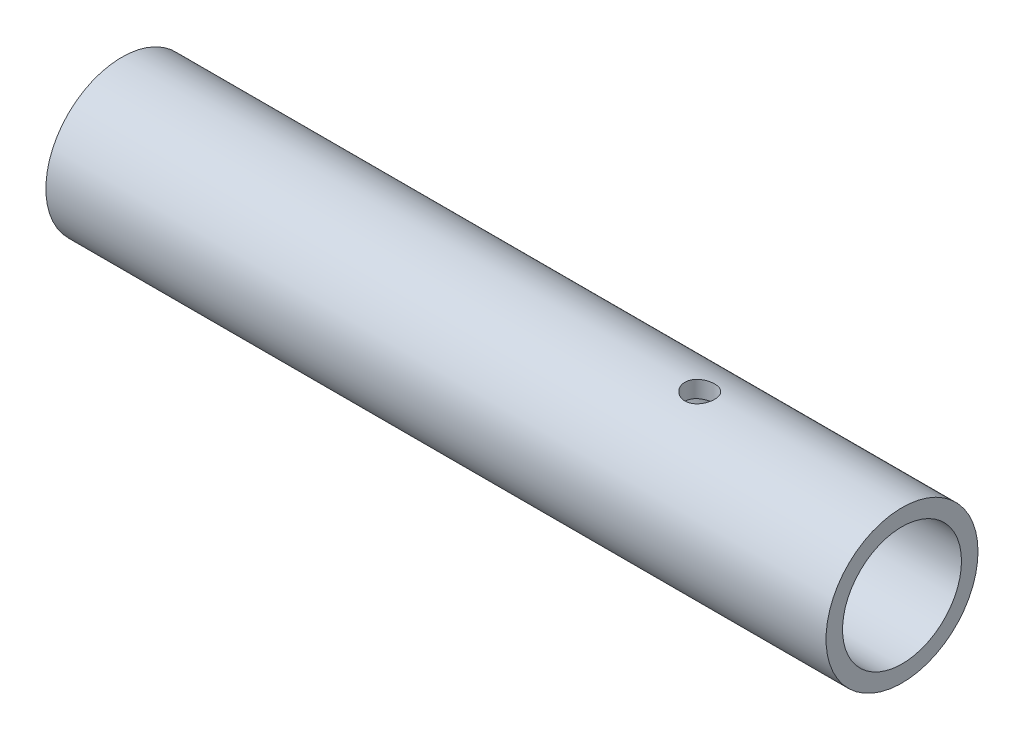
ISO-10303-21;
HEADER;
FILE_DESCRIPTION(('STEP AP214'),'2;1');
FILE_NAME('part.step','',(''),(''),'','','');
FILE_SCHEMA(('AUTOMOTIVE_DESIGN { 1 0 10303 214 1 1 1 1 }'));
ENDSEC;
DATA;
#1=APPLICATION_CONTEXT('core data for automotive mechanical design processes');
#2=APPLICATION_PROTOCOL_DEFINITION('international standard','automotive_design',2000,#1);
#3=PRODUCT_CONTEXT('',#1,'mechanical');
#4=PRODUCT('Part','Part','',(#3));
#5=PRODUCT_RELATED_PRODUCT_CATEGORY('part','',(#4));
#6=PRODUCT_DEFINITION_FORMATION('','',#4);
#7=PRODUCT_DEFINITION_CONTEXT('part definition',#1,'design');
#8=PRODUCT_DEFINITION('design','',#6,#7);
#9=PRODUCT_DEFINITION_SHAPE('','',#8);
#10=(LENGTH_UNIT() NAMED_UNIT(*) SI_UNIT(.MILLI.,.METRE.));
#11=(NAMED_UNIT(*) PLANE_ANGLE_UNIT() SI_UNIT($,.RADIAN.));
#12=(NAMED_UNIT(*) SI_UNIT($,.STERADIAN.) SOLID_ANGLE_UNIT());
#13=UNCERTAINTY_MEASURE_WITH_UNIT(LENGTH_MEASURE(1.E-05),#10,'distance_accuracy_value','');
#14=(GEOMETRIC_REPRESENTATION_CONTEXT(3) GLOBAL_UNCERTAINTY_ASSIGNED_CONTEXT((#13)) GLOBAL_UNIT_ASSIGNED_CONTEXT((#10,
#11,#12)) REPRESENTATION_CONTEXT('',''));
#15=CARTESIAN_POINT('',(0.,0.,0.));
#16=DIRECTION('',(0.,0.,1.));
#17=DIRECTION('',(1.,0.,0.));
#18=AXIS2_PLACEMENT_3D('',#15,#16,#17);
#19=CARTESIAN_POINT('',(254.,0.,0.));
#20=DIRECTION('',(-1.,0.,0.));
#21=DIRECTION('',(0.,0.,1.));
#22=AXIS2_PLACEMENT_3D('',#19,#20,#21);
#23=CYLINDRICAL_SURFACE('',#22,16.7005);
#24=CARTESIAN_POINT('',(0.,0.,0.));
#25=DIRECTION('',(1.,0.,0.));
#26=DIRECTION('',(0.,0.,-1.));
#27=AXIS2_PLACEMENT_3D('',#24,#25,#26);
#28=CIRCLE('',#27,16.7005);
#29=CARTESIAN_POINT('',(0.,0.,-16.7005));
#30=VERTEX_POINT('',#29);
#31=EDGE_CURVE('E10',#30,#30,#28,.T.);
#32=ORIENTED_EDGE('',*,*,#31,.T.);
#33=EDGE_LOOP('',(#32));
#34=FACE_BOUND('',#33,.T.);
#35=CARTESIAN_POINT('',(127.,16.3784509963549,3.26389999999997));
#36=CARTESIAN_POINT('',(126.818553713714,16.3784545734147,3.26389319517557));
#37=CARTESIAN_POINT('',(126.637020772944,16.3814989535375,3.24871822583977));
#38=CARTESIAN_POINT('',(126.279084138745,16.393330666063,3.18846627888111));
#39=CARTESIAN_POINT('',(126.102684764659,16.4021226964371,3.1433648397313));
#40=CARTESIAN_POINT('',(125.760245700198,16.4244167855804,3.02470671339751));
#41=CARTESIAN_POINT('',(125.594196130777,16.4379142691773,2.95117765920535));
#42=CARTESIAN_POINT('',(125.27679656067,16.4680930077172,2.77782627707842));
#43=CARTESIAN_POINT('',(125.125445619345,16.4847740587251,2.6780056331935));
#44=CARTESIAN_POINT('',(124.839685782665,16.5196921397592,2.45346715399136));
#45=CARTESIAN_POINT('',(124.705504337154,16.5379455711721,2.32846235907666));
#46=CARTESIAN_POINT('',(124.459876610062,16.5738071694482,2.05772407732135));
#47=CARTESIAN_POINT('',(124.348431883978,16.591415292096,1.91198917342002));
#48=CARTESIAN_POINT('',(124.150562586048,16.6241787687936,1.60242588580065));
#49=CARTESIAN_POINT('',(124.064353531285,16.6393125342302,1.43845726533343));
#50=CARTESIAN_POINT('',(123.920792617122,16.6652381312399,1.09801784501548));
#51=CARTESIAN_POINT('',(123.86343817922,16.6760303507642,0.921548163890675));
#52=CARTESIAN_POINT('',(123.779920880201,16.6919410030019,0.563475145343534));
#53=CARTESIAN_POINT('',(123.753374176773,16.6971292000769,0.381964487071239));
#54=CARTESIAN_POINT('',(123.731028925503,16.7014880032639,0.0169965480074079));
#55=CARTESIAN_POINT('',(123.735227542913,16.7006591641522,-0.166460551763006));
#56=CARTESIAN_POINT('',(123.773961410014,16.6931315126249,-0.527478063177689));
#57=CARTESIAN_POINT('',(123.808083259146,16.6865126940083,-0.705084738918122));
#58=CARTESIAN_POINT('',(123.905039985385,16.6682388041442,-1.05200191286461));
#59=CARTESIAN_POINT('',(123.967875974111,16.6565835379202,-1.22131208960472));
#60=CARTESIAN_POINT('',(124.120864327927,16.6294138104733,-1.54801686284208));
#61=CARTESIAN_POINT('',(124.211179877845,16.6138763968313,-1.7053330568331));
#62=CARTESIAN_POINT('',(124.416443068428,16.5806572402267,-2.00273080915886));
#63=CARTESIAN_POINT('',(124.531393421363,16.5629752612425,-2.14281046709115));
#64=CARTESIAN_POINT('',(124.784934887528,16.5270746871382,-2.40421067249115));
#65=CARTESIAN_POINT('',(124.923887754359,16.5088520592065,-2.52518004544845));
#66=CARTESIAN_POINT('',(125.220290366222,16.4742040536849,-2.74215423995587));
#67=CARTESIAN_POINT('',(125.377740430266,16.4577787071014,-2.83815863085572));
#68=CARTESIAN_POINT('',(125.70715791349,16.4285778238497,-3.00259091721656));
#69=CARTESIAN_POINT('',(125.87915331242,16.4158095388093,-3.07096413127713));
#70=CARTESIAN_POINT('',(126.232497463898,16.3954764923766,-3.17774053863906));
#71=CARTESIAN_POINT('',(126.413845054132,16.3879110860246,-3.21614744670498));
#72=CARTESIAN_POINT('',(126.777568960479,16.3789689965078,-3.26138067693054));
#73=CARTESIAN_POINT('',(126.959879959505,16.377493133792,-3.26871315798878));
#74=CARTESIAN_POINT('',(127.323120534865,16.3806313171536,-3.25294947975415));
#75=CARTESIAN_POINT('',(127.504050185252,16.3852450344327,-3.22985496332418));
#76=CARTESIAN_POINT('',(127.857704709797,16.3999498332161,-3.15432854360267));
#77=CARTESIAN_POINT('',(128.03048920925,16.409990751327,-3.10216518758293));
#78=CARTESIAN_POINT('',(128.364865954816,16.4343748926875,-2.97026813679652));
#79=CARTESIAN_POINT('',(128.526457313451,16.4487184566051,-2.89053225886072));
#80=CARTESIAN_POINT('',(128.836081213854,16.4803156776608,-2.70460067314256));
#81=CARTESIAN_POINT('',(128.983919341983,16.4976034233431,-2.59808712150518));
#82=CARTESIAN_POINT('',(129.259807826755,16.5330467132823,-2.36204922324446));
#83=CARTESIAN_POINT('',(129.387856240651,16.5512023425103,-2.23252262011955));
#84=CARTESIAN_POINT('',(129.622439097894,16.5866564256626,-1.95186745841594));
#85=CARTESIAN_POINT('',(129.728631982575,16.6039384859889,-1.80045100835698));
#86=CARTESIAN_POINT('',(129.914071192321,16.6354166114285,-1.48163273835385));
#87=CARTESIAN_POINT('',(129.993318615317,16.6496128022712,-1.31423157008527));
#88=CARTESIAN_POINT('',(130.122114494975,16.6732494760108,-0.969110676321435));
#89=CARTESIAN_POINT('',(130.171826225197,16.6827160570596,-0.791453749445667));
#90=CARTESIAN_POINT('',(130.240658350753,16.6959385983282,-0.430108531071001));
#91=CARTESIAN_POINT('',(130.25978225666,16.6996952138801,-0.246420934183898));
#92=CARTESIAN_POINT('',(130.266765017419,16.701059976732,0.118504114218192));
#93=CARTESIAN_POINT('',(130.255138258006,16.6987692823771,0.299731543011307));
#94=CARTESIAN_POINT('',(130.202082074801,16.6885085729308,0.657597247741723));
#95=CARTESIAN_POINT('',(130.160652991613,16.6805386227465,0.834235576103096));
#96=CARTESIAN_POINT('',(130.04939244875,16.6598166907006,1.17760651202132));
#97=CARTESIAN_POINT('',(129.979620182091,16.6470746793019,1.34435893899573));
#98=CARTESIAN_POINT('',(129.81371758837,16.6181833340721,1.66386484230208));
#99=CARTESIAN_POINT('',(129.717585294415,16.6020337460002,1.81661727286795));
#100=CARTESIAN_POINT('',(129.499943134021,16.567790330572,2.10633794767418));
#101=CARTESIAN_POINT('',(129.378063903588,16.5496703049923,2.2430256556268));
#102=CARTESIAN_POINT('',(129.113149352625,16.5136874296903,2.49418621724253));
#103=CARTESIAN_POINT('',(128.97010904311,16.4958246417077,2.60865381748637));
#104=CARTESIAN_POINT('',(128.665184399487,16.4621787073227,2.81322943497199));
#105=CARTESIAN_POINT('',(128.503122773793,16.4464186262533,2.90307713484601));
#106=CARTESIAN_POINT('',(128.165943578095,16.4190426235692,3.05412503906776));
#107=CARTESIAN_POINT('',(127.990838204351,16.4074228879929,3.11535162462943));
#108=CARTESIAN_POINT('',(127.679408964778,16.3920013024287,3.19533359258452));
#109=CARTESIAN_POINT('',(127.544879355037,16.3869509369549,3.22100071612694));
#110=CARTESIAN_POINT('',(127.2735828724,16.3801744879065,3.25528621562195));
#111=CARTESIAN_POINT('',(127.136816070436,16.3784482991421,3.26390513104648));
#112=CARTESIAN_POINT('',(127.,16.3784509963549,3.26389999999997));
#113=B_SPLINE_CURVE_WITH_KNOTS('',3,(#35,#36,#37,#38,#39,#40,#41,#42,#43,#44,#45,#46,#47,#48,
#49,#50,#51,#52,#53,#54,#55,#56,#57,#58,#59,#60,#61,#62,#63,#64,#65,#66,#67,#68,#69,#70,#71,#72,
#73,#74,#75,#76,#77,#78,#79,#80,#81,#82,#83,#84,#85,#86,#87,#88,#89,#90,#91,#92,#93,#94,#95,#96,
#97,#98,#99,#100,#101,#102,#103,#104,#105,#106,#107,#108,#109,#110,#111,#112),.UNSPECIFIED.,.T.,
.F.,(4,2,2,2,2,2,2,2,2,2,2,2,2,2,2,2,2,2,2,2,2,2,2,2,2,2,2,2,2,2,2,2,2,2,2,2,2,2,4),(0.,
0.543838011851132,1.08812109867869,1.63187644133418,2.17559696340594,2.72590420295353,
3.2762490782831,3.831165346531,4.38603201763736,4.93390859919531,5.48173466666149,
6.02210947590471,6.56250520661795,7.10617482279139,7.64990432727748,8.20268697648642,
8.7554791606594,9.30936001165929,9.86317219006378,10.4079280171506,10.9526544321187,
11.4924299764933,12.032248269632,12.5788044673675,13.125414286251,13.6800080693687,
14.2345792520847,14.7860555271326,15.3374685045301,15.8797162227245,16.4219577437688,
16.9630726011032,17.504227845529,18.0537494335348,18.6034007851143,19.1586573535361,
19.713401105892,20.1234846400338,20.5335551973219),.UNSPECIFIED.);
#114=CARTESIAN_POINT('',(127.,16.3784509963549,3.26389999999997));
#115=VERTEX_POINT('',#114);
#116=EDGE_CURVE('E79',#115,#115,#113,.T.);
#117=ORIENTED_EDGE('',*,*,#116,.T.);
#118=EDGE_LOOP('',(#117));
#119=FACE_BOUND('',#118,.T.);
#120=CARTESIAN_POINT('',(123.7361,-16.7005,0.));
#121=CARTESIAN_POINT('',(123.736106775756,-16.7004966719391,0.181483597947742));
#122=CARTESIAN_POINT('',(123.751287775446,-16.6975113087399,0.363053771332893));
#123=CARTESIAN_POINT('',(123.811565845321,-16.6858899817864,0.721067717038991));
#124=CARTESIAN_POINT('',(123.856687233667,-16.677249424853,0.897507200417728));
#125=CARTESIAN_POINT('',(123.975403683828,-16.6552831908012,1.24003120402988));
#126=CARTESIAN_POINT('',(124.048972050381,-16.6419619072453,1.40612526346626));
#127=CARTESIAN_POINT('',(124.222416098506,-16.6120847923371,1.72359982001725));
#128=CARTESIAN_POINT('',(124.322290005034,-16.5955291792501,1.8749813089626));
#129=CARTESIAN_POINT('',(124.54688305753,-16.5607675429942,2.1607084870949));
#130=CARTESIAN_POINT('',(124.671877204119,-16.5425445895903,2.29483597685554));
#131=CARTESIAN_POINT('',(124.942571297181,-16.5066262038143,2.54035904431321));
#132=CARTESIAN_POINT('',(125.088272810045,-16.4889308114717,2.65175290078985));
#133=CARTESIAN_POINT('',(125.397805025885,-16.4559060542504,2.84956751041692));
#134=CARTESIAN_POINT('',(125.56178170667,-16.440598490149,2.93576380448387));
#135=CARTESIAN_POINT('',(125.902238566393,-16.4143223190422,3.07929892720361));
#136=CARTESIAN_POINT('',(126.078717567108,-16.4033533038102,3.13664047102126));
#137=CARTESIAN_POINT('',(126.43682660245,-16.3871671511717,3.22013301241122));
#138=CARTESIAN_POINT('',(126.61836433271,-16.3818796336776,3.24666599436722));
#139=CARTESIAN_POINT('',(126.983385832867,-16.3774431798516,3.26897441242651));
#140=CARTESIAN_POINT('',(127.166869411181,-16.3782936446905,3.26475284898047));
#141=CARTESIAN_POINT('',(127.527789679386,-16.3859730690505,3.22598118443871));
#142=CARTESIAN_POINT('',(127.705275371228,-16.3927159656055,3.19186765635166));
#143=CARTESIAN_POINT('',(128.051954938799,-16.4112851101643,3.09496894705632));
#144=CARTESIAN_POINT('',(128.221148434318,-16.4231115910164,3.03218245250376));
#145=CARTESIAN_POINT('',(128.547706130163,-16.4506040829533,2.87929947973738));
#146=CARTESIAN_POINT('',(128.704986618325,-16.4662944654566,2.78902875651037));
#147=CARTESIAN_POINT('',(129.002331662869,-16.4997310306065,2.58386283029639));
#148=CARTESIAN_POINT('',(129.142394323867,-16.5174774391689,2.46896492009798));
#149=CARTESIAN_POINT('',(129.40384820398,-16.5534001313523,2.21546259747301));
#150=CARTESIAN_POINT('',(129.52487784656,-16.5715785664494,2.07648527306975));
#151=CARTESIAN_POINT('',(129.741962257696,-16.6060378767627,1.78001160313921));
#152=CARTESIAN_POINT('',(129.838016733025,-16.6223187296989,1.6225150402147));
#153=CARTESIAN_POINT('',(130.002485980909,-16.6511857448123,1.29308111551052));
#154=CARTESIAN_POINT('',(130.070860808202,-16.6637665602585,1.12112331316856));
#155=CARTESIAN_POINT('',(130.177651774277,-16.6837751432131,0.767861427035756));
#156=CARTESIAN_POINT('',(130.216071375564,-16.691203506279,0.586558426034048));
#157=CARTESIAN_POINT('',(130.261352603597,-16.6999876907162,0.222861171440751));
#158=CARTESIAN_POINT('',(130.2687092719,-16.7014387613551,0.0405307799548781));
#159=CARTESIAN_POINT('',(130.252987038392,-16.6983688866494,-0.322754231602682));
#160=CARTESIAN_POINT('',(130.229909766959,-16.6938482612146,-0.503708924849627));
#161=CARTESIAN_POINT('',(130.154386130064,-16.679402432097,-0.857518845901425));
#162=CARTESIAN_POINT('',(130.102192463689,-16.6695237507744,-1.0304300801412));
#163=CARTESIAN_POINT('',(129.970192763857,-16.6454652259661,-1.36504700995945));
#164=CARTESIAN_POINT('',(129.890384732214,-16.6312850712336,-1.52675189362589));
#165=CARTESIAN_POINT('',(129.704341624287,-16.5999591227001,-1.83646298433188));
#166=CARTESIAN_POINT('',(129.597806850211,-16.5827804191035,-1.98428576503835));
#167=CARTESIAN_POINT('',(129.361737252328,-16.5474430314081,-2.26013352813523));
#168=CARTESIAN_POINT('',(129.232200081546,-16.5292842474417,-2.38815648781824));
#169=CARTESIAN_POINT('',(128.951553730027,-16.4937141213386,-2.62267015659225));
#170=CARTESIAN_POINT('',(128.800159005092,-16.4763174339377,-2.72882175212988));
#171=CARTESIAN_POINT('',(128.481396569498,-16.4445457864632,-2.91418860150566));
#172=CARTESIAN_POINT('',(128.314029482456,-16.4301707084856,-2.99340490644003));
#173=CARTESIAN_POINT('',(127.968898428124,-16.406186989638,-3.12218287646266));
#174=CARTESIAN_POINT('',(127.791192165306,-16.3965542890212,-3.17189449915426));
#175=CARTESIAN_POINT('',(127.429741750409,-16.3830934803205,-3.24070974683919));
#176=CARTESIAN_POINT('',(127.245998348699,-16.3792646536275,-3.25981716112136));
#177=CARTESIAN_POINT('',(126.881091191514,-16.3778837287058,-3.26674633387894));
#178=CARTESIAN_POINT('',(126.69993779729,-16.3802241945844,-3.25510358772846));
#179=CARTESIAN_POINT('',(126.342224427647,-16.3906787750187,-3.20204126403765));
#180=CARTESIAN_POINT('',(126.165664418971,-16.3987928477609,-3.16062190214508));
#181=CARTESIAN_POINT('',(125.822470853863,-16.419833385607,-3.04941620512077));
#182=CARTESIAN_POINT('',(125.655816247381,-16.4327491889843,-2.97969268503245));
#183=CARTESIAN_POINT('',(125.336486037849,-16.4619445128348,-2.81391821816692));
#184=CARTESIAN_POINT('',(125.183811540286,-16.4782242989868,-2.71786519175718));
#185=CARTESIAN_POINT('',(124.894102989115,-16.5126437731481,-2.50031714525346));
#186=CARTESIAN_POINT('',(124.757363204566,-16.5308093725168,-2.37843427754532));
#187=CARTESIAN_POINT('',(124.506099262145,-16.5667647976037,-2.11349014710452));
#188=CARTESIAN_POINT('',(124.391580214566,-16.5845545360457,-1.97042402598339));
#189=CARTESIAN_POINT('',(124.186940635134,-16.6179613743855,-1.66547201824119));
#190=CARTESIAN_POINT('',(124.09707321668,-16.6335551890088,-1.50341363159979));
#191=CARTESIAN_POINT('',(123.945987585852,-16.6605847291089,-1.16623959090203));
#192=CARTESIAN_POINT('',(123.884743144469,-16.6720242592617,-0.991136062224215));
#193=CARTESIAN_POINT('',(123.804717605944,-16.6871929046613,-0.679660912139079));
#194=CARTESIAN_POINT('',(123.779031167417,-16.6921542444122,-0.545080722884243));
#195=CARTESIAN_POINT('',(123.744720059972,-16.6988089990342,-0.27368339169512));
#196=CARTESIAN_POINT('',(123.736094890047,-16.7005025098655,-0.136866315566457));
#197=CARTESIAN_POINT('',(123.7361,-16.7005,0.));
#198=B_SPLINE_CURVE_WITH_KNOTS('',3,(#120,#121,#122,#123,#124,#125,#126,#127,#128,#129,#130,
#131,#132,#133,#134,#135,#136,#137,#138,#139,#140,#141,#142,#143,#144,#145,#146,#147,#148,#149,
#150,#151,#152,#153,#154,#155,#156,#157,#158,#159,#160,#161,#162,#163,#164,#165,#166,#167,#168,
#169,#170,#171,#172,#173,#174,#175,#176,#177,#178,#179,#180,#181,#182,#183,#184,#185,#186,#187,
#188,#189,#190,#191,#192,#193,#194,#195,#196,#197),.UNSPECIFIED.,.T.,.F.,(4,2,2,2,2,2,2,2,2,2,2,
2,2,2,2,2,2,2,2,2,2,2,2,2,2,2,2,2,2,2,2,2,2,2,2,2,2,2,4),(0.,0.543950159324411,1.08834266710056,
1.63222554010916,2.17607172242006,2.72623219078756,3.27643429774323,3.83139784085203,
4.38630915341318,4.93426426573039,5.48216591959973,6.02219638264132,6.5622515838647,
7.10580456443049,7.64941732722914,8.20235688641288,8.75530293719887,9.30904413910584,
9.86272132492762,10.4075405998757,10.9523306894876,11.4924645384159,12.0326374797938,
12.5791618209733,13.1257419570842,13.6802470524964,14.2347305069643,14.7863711140939,
15.3379434140415,15.8799740141397,16.4220006887916,16.9628309703467,17.5037039816243,
18.0533608295184,18.6031439372836,19.1583769915035,19.7131002487933,20.1233336874724,
20.53355507938),.UNSPECIFIED.);
#199=CARTESIAN_POINT('',(123.7361,-16.7005,0.));
#200=VERTEX_POINT('',#199);
#201=EDGE_CURVE('E51',#200,#200,#198,.T.);
#202=ORIENTED_EDGE('',*,*,#201,.T.);
#203=EDGE_LOOP('',(#202));
#204=FACE_BOUND('',#203,.T.);
#205=CARTESIAN_POINT('',(171.45,0.,0.));
#206=DIRECTION('',(1.,0.,0.));
#207=DIRECTION('',(0.,0.,-1.));
#208=AXIS2_PLACEMENT_3D('',#205,#206,#207);
#209=CIRCLE('',#208,16.7005);
#210=CARTESIAN_POINT('',(171.45,0.,-16.7005));
#211=VERTEX_POINT('',#210);
#212=EDGE_CURVE('E85',#211,#211,#209,.T.);
#213=ORIENTED_EDGE('',*,*,#212,.F.);
#214=EDGE_LOOP('',(#213));
#215=FACE_BOUND('',#214,.T.);
#216=ADVANCED_FACE('F38',(#34,#119,#204,#215),#23,.T.);
#217=CARTESIAN_POINT('',(254.,0.,0.));
#218=DIRECTION('',(-1.,0.,0.));
#219=DIRECTION('',(0.,0.,1.));
#220=AXIS2_PLACEMENT_3D('',#217,#218,#219);
#221=CYLINDRICAL_SURFACE('',#220,13.0683);
#222=CARTESIAN_POINT('',(0.,0.,0.));
#223=DIRECTION('',(1.,0.,0.));
#224=DIRECTION('',(0.,0.,-1.));
#225=AXIS2_PLACEMENT_3D('',#222,#223,#224);
#226=CIRCLE('',#225,13.0683);
#227=CARTESIAN_POINT('',(0.,0.,-13.0683));
#228=VERTEX_POINT('',#227);
#229=EDGE_CURVE('E46',#228,#228,#226,.T.);
#230=ORIENTED_EDGE('',*,*,#229,.F.);
#231=EDGE_LOOP('',(#230));
#232=FACE_BOUND('',#231,.T.);
#233=CARTESIAN_POINT('',(127.,12.6541464224182,3.26389999999997));
#234=CARTESIAN_POINT('',(126.8197603801,12.6541498665457,3.26389487005727));
#235=CARTESIAN_POINT('',(126.639463951856,12.658039343354,3.24891931447462));
#236=CARTESIAN_POINT('',(126.284048208243,12.6731373508395,3.18950804081929));
#237=CARTESIAN_POINT('',(126.108931974098,12.6843501494954,3.14505514333585));
#238=CARTESIAN_POINT('',(125.769068951021,12.7127474566362,3.02821731292329));
#239=CARTESIAN_POINT('',(125.60430910977,12.7299242628337,2.95586839338792));
#240=CARTESIAN_POINT('',(125.289247792188,12.7683046059048,2.78540185976016));
#241=CARTESIAN_POINT('',(125.138946922729,12.7895083116843,2.68728316470388));
#242=CARTESIAN_POINT('',(124.853768877992,12.8340746644002,2.46576046210242));
#243=CARTESIAN_POINT('',(124.71925608506,12.8574717499442,2.34189420249946));
#244=CARTESIAN_POINT('',(124.472682494661,12.9034898264856,2.07338814629195));
#245=CARTESIAN_POINT('',(124.360623793113,12.9261107448704,1.92874641261629));
#246=CARTESIAN_POINT('',(124.160648913987,12.9684086913342,1.62029941508486));
#247=CARTESIAN_POINT('',(124.073090635481,12.9880403413031,1.4562553539038));
#248=CARTESIAN_POINT('',(123.926929063669,13.021754935617,1.11520517144153));
#249=CARTESIAN_POINT('',(123.868321506807,13.0358386969344,0.938200963205097));
#250=CARTESIAN_POINT('',(123.78289198644,13.0566271990577,0.580053588307859));
#251=CARTESIAN_POINT('',(123.755451261866,13.063475389697,0.399066486178454));
#252=CARTESIAN_POINT('',(123.731192153959,13.0695210078802,0.0349367976721225));
#253=CARTESIAN_POINT('',(123.734369251653,13.0687195644559,-0.148205466633079));
#254=CARTESIAN_POINT('',(123.770810448584,13.059663021681,-0.507155486008183));
#255=CARTESIAN_POINT('',(123.803406660556,13.0515733895928,-0.683035849279494));
#256=CARTESIAN_POINT('',(123.896687326312,13.0290420651723,-1.02674690486388));
#257=CARTESIAN_POINT('',(123.957373273676,13.0146000350744,-1.19457716861578));
#258=CARTESIAN_POINT('',(124.105651562321,12.980733407514,-1.51918431677917));
#259=CARTESIAN_POINT('',(124.193481718752,12.9612650318926,-1.67584781392577));
#260=CARTESIAN_POINT('',(124.393374865019,12.9194576855627,-1.97244647237706));
#261=CARTESIAN_POINT('',(124.505442063498,12.8971182165768,-2.11237872182197));
#262=CARTESIAN_POINT('',(124.754208884998,12.8512911900573,-2.37552576964437));
#263=CARTESIAN_POINT('',(124.891492131556,12.8277889203778,-2.49818686603543));
#264=CARTESIAN_POINT('',(125.184925871298,12.7828374370845,-2.71886950242736));
#265=CARTESIAN_POINT('',(125.341077242306,12.7613883190751,-2.81688989538567));
#266=CARTESIAN_POINT('',(125.668899277047,12.7229191456513,-2.98586230738371));
#267=CARTESIAN_POINT('',(125.840641276096,12.7059209896026,-3.0566812595333));
#268=CARTESIAN_POINT('',(126.194120414262,12.6785594740963,-3.16826944176));
#269=CARTESIAN_POINT('',(126.375855410288,12.6681946980278,-3.20904508810496));
#270=CARTESIAN_POINT('',(126.7390274426,12.6555707305042,-3.25847099196052));
#271=CARTESIAN_POINT('',(126.920346028074,12.6531050561873,-3.26793982748043));
#272=CARTESIAN_POINT('',(127.281972860564,12.6559964618753,-3.25672414151975));
#273=CARTESIAN_POINT('',(127.462281198856,12.6613528233241,-3.23604238976434));
#274=CARTESIAN_POINT('',(127.813731132622,12.6790869347488,-3.16583028143518));
#275=CARTESIAN_POINT('',(127.984974313241,12.6913486522407,-3.11677631143261));
#276=CARTESIAN_POINT('',(128.316807037039,12.7214017722217,-2.99174032174483));
#277=CARTESIAN_POINT('',(128.477395317418,12.7391938287409,-2.91575511696363));
#278=CARTESIAN_POINT('',(128.78682868142,12.7787378056656,-2.73729950737114));
#279=CARTESIAN_POINT('',(128.935382208881,12.800560449758,-2.63433957686156));
#280=CARTESIAN_POINT('',(129.213404181874,12.8455331169144,-2.40547632524734));
#281=CARTESIAN_POINT('',(129.34286949108,12.8686833572457,-2.27956924135));
#282=CARTESIAN_POINT('',(129.582354798878,12.9144023998633,-2.00462943791343));
#283=CARTESIAN_POINT('',(129.691808598572,12.9369422542905,-1.85509782138161));
#284=CARTESIAN_POINT('',(129.884052208416,12.978302496039,-1.53930184599166));
#285=CARTESIAN_POINT('',(129.966843408662,12.9971230772504,-1.37303836006806));
#286=CARTESIAN_POINT('',(130.102693596105,13.0288056526969,-1.02964666435068));
#287=CARTESIAN_POINT('',(130.155966260836,13.0417103497647,-0.85260711415966));
#288=CARTESIAN_POINT('',(130.231908807924,13.0602940680189,-0.491723556324322));
#289=CARTESIAN_POINT('',(130.254584584042,13.0659744807796,-0.307880866154799));
#290=CARTESIAN_POINT('',(130.268358684043,13.0694129307713,0.0560707028070125));
#291=CARTESIAN_POINT('',(130.26029267334,13.0673806319752,0.236146453787146));
#292=CARTESIAN_POINT('',(130.214725866569,13.0560868218867,0.592290476790374));
#293=CARTESIAN_POINT('',(130.17722594279,13.0468255248294,0.768358867414616));
#294=CARTESIAN_POINT('',(130.074303605575,13.0221466091123,1.1106174435097));
#295=CARTESIAN_POINT('',(130.009032030279,13.006762275664,1.27685554493358));
#296=CARTESIAN_POINT('',(129.852556141865,12.9714574984479,1.596114511096));
#297=CARTESIAN_POINT('',(129.761348565286,12.951536483904,1.74913370937273));
#298=CARTESIAN_POINT('',(129.553039664326,12.9087110855812,2.04157448090383));
#299=CARTESIAN_POINT('',(129.435371194027,12.8857467421418,2.18058329181663));
#300=CARTESIAN_POINT('',(129.17858215214,12.8396930445191,2.43716587446908));
#301=CARTESIAN_POINT('',(129.039456152494,12.8166036601345,2.55473420599459));
#302=CARTESIAN_POINT('',(128.74058470328,12.7724250306431,2.76724619338051));
#303=CARTESIAN_POINT('',(128.580503708733,12.7513810048743,2.86172808491328));
#304=CARTESIAN_POINT('',(128.24622749924,12.7142840346146,3.02229805206948));
#305=CARTESIAN_POINT('',(128.072042677942,12.6982274561339,3.08840681459617));
#306=CARTESIAN_POINT('',(127.748466924305,12.6754365623556,3.18049600309898));
#307=CARTESIAN_POINT('',(127.600626080403,12.6675127842803,3.21170439030432));
#308=CARTESIAN_POINT('',(127.301869932157,12.656866492936,3.25340765729332));
#309=CARTESIAN_POINT('',(127.150954890053,12.654143537881,3.26390429644675));
#310=CARTESIAN_POINT('',(127.,12.6541464224182,3.26389999999997));
#311=B_SPLINE_CURVE_WITH_KNOTS('',3,(#233,#234,#235,#236,#237,#238,#239,#240,#241,#242,#243,
#244,#245,#246,#247,#248,#249,#250,#251,#252,#253,#254,#255,#256,#257,#258,#259,#260,#261,#262,
#263,#264,#265,#266,#267,#268,#269,#270,#271,#272,#273,#274,#275,#276,#277,#278,#279,#280,#281,
#282,#283,#284,#285,#286,#287,#288,#289,#290,#291,#292,#293,#294,#295,#296,#297,#298,#299,#300,
#301,#302,#303,#304,#305,#306,#307,#308,#309,#310),.UNSPECIFIED.,.T.,.F.,(4,2,2,2,2,2,2,2,2,2,2,
2,2,2,2,2,2,2,2,2,2,2,2,2,2,2,2,2,2,2,2,2,2,2,2,2,2,2,4),(0.,0.540164514716896,1.08064411461008,
1.62042828619218,2.16023510369984,2.71073184489949,3.26127994687038,3.81949414064445,
4.37762610200201,4.92447229397422,5.47123777657098,6.00589418676205,6.54057902880636,
7.08008790696716,7.61969054350123,8.17386956862666,8.72807438641131,9.2849568034896,
9.84172025419008,10.3838058285248,10.9258416083583,11.4590300990647,11.9922816698166,
12.5359760396294,13.0797596428567,13.6371200064458,14.1944513065093,14.7476936804915,
15.3008294702842,15.8390377947818,16.3772301697911,16.9125360050735,17.4479092263455,
17.9960874158373,18.5444045047421,19.1029258036373,19.6610391889229,20.1134780165111,
20.5658784098025),.UNSPECIFIED.);
#312=CARTESIAN_POINT('',(127.,12.6541464224182,3.26389999999997));
#313=VERTEX_POINT('',#312);
#314=EDGE_CURVE('E55',#313,#313,#311,.T.);
#315=ORIENTED_EDGE('',*,*,#314,.F.);
#316=EDGE_LOOP('',(#315));
#317=FACE_BOUND('',#316,.T.);
#318=CARTESIAN_POINT('',(127.,-12.6541464224182,3.26389999999997));
#319=CARTESIAN_POINT('',(127.1802396199,-12.6541498665457,3.26389487005727));
#320=CARTESIAN_POINT('',(127.360536048144,-12.658039343354,3.24891931447462));
#321=CARTESIAN_POINT('',(127.715951791757,-12.6731373508395,3.18950804081929));
#322=CARTESIAN_POINT('',(127.891068025902,-12.6843501494954,3.14505514333585));
#323=CARTESIAN_POINT('',(128.230931048979,-12.7127474566362,3.02821731292329));
#324=CARTESIAN_POINT('',(128.39569089023,-12.7299242628337,2.95586839338792));
#325=CARTESIAN_POINT('',(128.710752207812,-12.7683046059048,2.78540185976016));
#326=CARTESIAN_POINT('',(128.861053077271,-12.7895083116844,2.68728316470388));
#327=CARTESIAN_POINT('',(129.146231122008,-12.8340746644002,2.46576046210241));
#328=CARTESIAN_POINT('',(129.280743914941,-12.8574717499442,2.34189420249946));
#329=CARTESIAN_POINT('',(129.527317505339,-12.9034898264856,2.07338814629195));
#330=CARTESIAN_POINT('',(129.639376206887,-12.9261107448704,1.92874641261629));
#331=CARTESIAN_POINT('',(129.839351086013,-12.9684086913342,1.62029941508486));
#332=CARTESIAN_POINT('',(129.926909364519,-12.9880403413031,1.45625535390379));
#333=CARTESIAN_POINT('',(130.073070936331,-13.021754935617,1.11520517144153));
#334=CARTESIAN_POINT('',(130.131678493193,-13.0358386969344,0.938200963205098));
#335=CARTESIAN_POINT('',(130.21710801356,-13.0566271990577,0.580053588307863));
#336=CARTESIAN_POINT('',(130.244548738134,-13.063475389697,0.399066486178456));
#337=CARTESIAN_POINT('',(130.268807846041,-13.0695210078802,0.0349367976721254));
#338=CARTESIAN_POINT('',(130.265630748347,-13.0687195644559,-0.148205466633074));
#339=CARTESIAN_POINT('',(130.229189551416,-13.059663021681,-0.507155486008179));
#340=CARTESIAN_POINT('',(130.196593339444,-13.0515733895928,-0.683035849279494));
#341=CARTESIAN_POINT('',(130.103312673688,-13.0290420651723,-1.02674690486388));
#342=CARTESIAN_POINT('',(130.042626726324,-13.0146000350744,-1.19457716861578));
#343=CARTESIAN_POINT('',(129.894348437679,-12.980733407514,-1.51918431677917));
#344=CARTESIAN_POINT('',(129.806518281248,-12.9612650318926,-1.67584781392578));
#345=CARTESIAN_POINT('',(129.606625134981,-12.9194576855627,-1.97244647237706));
#346=CARTESIAN_POINT('',(129.494557936502,-12.8971182165768,-2.11237872182197));
#347=CARTESIAN_POINT('',(129.245791115002,-12.8512911900573,-2.37552576964437));
#348=CARTESIAN_POINT('',(129.108507868444,-12.8277889203778,-2.49818686603544));
#349=CARTESIAN_POINT('',(128.815074128702,-12.7828374370845,-2.71886950242737));
#350=CARTESIAN_POINT('',(128.658922757694,-12.7613883190751,-2.81688989538567));
#351=CARTESIAN_POINT('',(128.331100722953,-12.7229191456513,-2.98586230738371));
#352=CARTESIAN_POINT('',(128.159358723904,-12.7059209896026,-3.0566812595333));
#353=CARTESIAN_POINT('',(127.805879585738,-12.6785594740963,-3.16826944176));
#354=CARTESIAN_POINT('',(127.624144589713,-12.6681946980278,-3.20904508810496));
#355=CARTESIAN_POINT('',(127.2609725574,-12.6555707305042,-3.25847099196052));
#356=CARTESIAN_POINT('',(127.079653971926,-12.6531050561873,-3.26793982748042));
#357=CARTESIAN_POINT('',(126.718027139436,-12.6559964618753,-3.25672414151975));
#358=CARTESIAN_POINT('',(126.537718801144,-12.6613528233241,-3.23604238976434));
#359=CARTESIAN_POINT('',(126.186268867378,-12.6790869347488,-3.16583028143518));
#360=CARTESIAN_POINT('',(126.015025686759,-12.6913486522407,-3.11677631143261));
#361=CARTESIAN_POINT('',(125.683192962961,-12.7214017722217,-2.99174032174483));
#362=CARTESIAN_POINT('',(125.522604682582,-12.7391938287409,-2.91575511696363));
#363=CARTESIAN_POINT('',(125.21317131858,-12.7787378056656,-2.73729950737114));
#364=CARTESIAN_POINT('',(125.064617791119,-12.800560449758,-2.63433957686156));
#365=CARTESIAN_POINT('',(124.786595818126,-12.8455331169144,-2.40547632524734));
#366=CARTESIAN_POINT('',(124.65713050892,-12.8686833572457,-2.27956924135001));
#367=CARTESIAN_POINT('',(124.417645201122,-12.9144023998633,-2.00462943791343));
#368=CARTESIAN_POINT('',(124.308191401428,-12.9369422542905,-1.8550978213816));
#369=CARTESIAN_POINT('',(124.115947791584,-12.978302496039,-1.53930184599166));
#370=CARTESIAN_POINT('',(124.033156591338,-12.9971230772504,-1.37303836006807));
#371=CARTESIAN_POINT('',(123.897306403895,-13.0288056526969,-1.0296466643507));
#372=CARTESIAN_POINT('',(123.844033739164,-13.0417103497647,-0.852607114159676));
#373=CARTESIAN_POINT('',(123.768091192076,-13.0602940680189,-0.49172355632433));
#374=CARTESIAN_POINT('',(123.745415415958,-13.0659744807796,-0.307880866154806));
#375=CARTESIAN_POINT('',(123.731641315957,-13.0694129307713,0.0560707028070052));
#376=CARTESIAN_POINT('',(123.73970732666,-13.0673806319752,0.236146453787138));
#377=CARTESIAN_POINT('',(123.785274133431,-13.0560868218867,0.592290476790369));
#378=CARTESIAN_POINT('',(123.82277405721,-13.0468255248294,0.768358867414615));
#379=CARTESIAN_POINT('',(123.925696394425,-13.0221466091123,1.1106174435097));
#380=CARTESIAN_POINT('',(123.990967969721,-13.006762275664,1.27685554493358));
#381=CARTESIAN_POINT('',(124.147443858135,-12.9714574984479,1.59611451109599));
#382=CARTESIAN_POINT('',(124.238651434714,-12.951536483904,1.74913370937272));
#383=CARTESIAN_POINT('',(124.446960335674,-12.9087110855812,2.04157448090382));
#384=CARTESIAN_POINT('',(124.564628805973,-12.8857467421418,2.1805832918166));
#385=CARTESIAN_POINT('',(124.82141784786,-12.8396930445191,2.43716587446906));
#386=CARTESIAN_POINT('',(124.960543847506,-12.8166036601345,2.55473420599458));
#387=CARTESIAN_POINT('',(125.25941529672,-12.7724250306431,2.7672461933805));
#388=CARTESIAN_POINT('',(125.419496291267,-12.7513810048743,2.86172808491328));
#389=CARTESIAN_POINT('',(125.75377250076,-12.7142840346146,3.02229805206948));
#390=CARTESIAN_POINT('',(125.927957322058,-12.6982274561339,3.08840681459617));
#391=CARTESIAN_POINT('',(126.251533075695,-12.6754365623556,3.18049600309898));
#392=CARTESIAN_POINT('',(126.399373919597,-12.6675127842803,3.21170439030432));
#393=CARTESIAN_POINT('',(126.698130067843,-12.656866492936,3.25340765729332));
#394=CARTESIAN_POINT('',(126.849045109947,-12.654143537881,3.26390429644675));
#395=CARTESIAN_POINT('',(127.,-12.6541464224182,3.26389999999997));
#396=B_SPLINE_CURVE_WITH_KNOTS('',3,(#318,#319,#320,#321,#322,#323,#324,#325,#326,#327,#328,
#329,#330,#331,#332,#333,#334,#335,#336,#337,#338,#339,#340,#341,#342,#343,#344,#345,#346,#347,
#348,#349,#350,#351,#352,#353,#354,#355,#356,#357,#358,#359,#360,#361,#362,#363,#364,#365,#366,
#367,#368,#369,#370,#371,#372,#373,#374,#375,#376,#377,#378,#379,#380,#381,#382,#383,#384,#385,
#386,#387,#388,#389,#390,#391,#392,#393,#394,#395),.UNSPECIFIED.,.T.,.F.,(4,2,2,2,2,2,2,2,2,2,2,
2,2,2,2,2,2,2,2,2,2,2,2,2,2,2,2,2,2,2,2,2,2,2,2,2,2,2,4),(0.,0.540164514716896,1.08064411461008,
1.62042828619218,2.16023510369987,2.71073184489949,3.26127994687038,3.81949414064445,
4.37762610200201,4.92447229397421,5.47123777657098,6.00589418676205,6.54057902880637,
7.08008790696719,7.61969054350123,8.17386956862667,8.72807438641131,9.28495680348959,
9.84172025419008,10.3838058285248,10.9258416083583,11.4590300990647,11.9922816698166,
12.5359760396294,13.0797596428567,13.6371200064458,14.1944513065093,14.7476936804915,
15.3008294702842,15.8390377947818,16.3772301697911,16.9125360050735,17.4479092263455,
17.9960874158373,18.5444045047421,19.1029258036373,19.6610391889229,20.1134780165111,
20.5658784098025),.UNSPECIFIED.);
#397=CARTESIAN_POINT('',(127.,-12.6541464224182,3.26389999999997));
#398=VERTEX_POINT('',#397);
#399=EDGE_CURVE('E62',#398,#398,#396,.T.);
#400=ORIENTED_EDGE('',*,*,#399,.F.);
#401=EDGE_LOOP('',(#400));
#402=FACE_BOUND('',#401,.T.);
#403=CARTESIAN_POINT('',(171.45,0.,0.));
#404=DIRECTION('',(1.,0.,0.));
#405=DIRECTION('',(0.,0.,-1.));
#406=AXIS2_PLACEMENT_3D('',#403,#404,#405);
#407=CIRCLE('',#406,13.0683);
#408=CARTESIAN_POINT('',(171.45,0.,-13.0683));
#409=VERTEX_POINT('',#408);
#410=EDGE_CURVE('E42',#409,#409,#407,.T.);
#411=ORIENTED_EDGE('',*,*,#410,.T.);
#412=EDGE_LOOP('',(#411));
#413=FACE_BOUND('',#412,.T.);
#414=ADVANCED_FACE('F66',(#232,#317,#402,#413),#221,.F.);
#415=CARTESIAN_POINT('',(0.,0.,0.));
#416=DIRECTION('',(1.,0.,0.));
#417=DIRECTION('',(0.,0.,-1.));
#418=AXIS2_PLACEMENT_3D('',#415,#416,#417);
#419=PLANE('',#418);
#420=ORIENTED_EDGE('',*,*,#31,.F.);
#421=EDGE_LOOP('',(#420));
#422=FACE_BOUND('',#421,.T.);
#423=ORIENTED_EDGE('',*,*,#229,.T.);
#424=EDGE_LOOP('',(#423));
#425=FACE_BOUND('',#424,.T.);
#426=ADVANCED_FACE('F117',(#422,#425),#419,.F.);
#427=CARTESIAN_POINT('',(127.,-16.7005,0.));
#428=DIRECTION('',(0.,1.,0.));
#429=DIRECTION('',(0.,0.,1.));
#430=AXIS2_PLACEMENT_3D('',#427,#428,#429);
#431=CYLINDRICAL_SURFACE('',#430,3.26389999999998);
#432=ORIENTED_EDGE('',*,*,#314,.T.);
#433=EDGE_LOOP('',(#432));
#434=FACE_BOUND('',#433,.T.);
#435=ORIENTED_EDGE('',*,*,#116,.F.);
#436=EDGE_LOOP('',(#435));
#437=FACE_BOUND('',#436,.T.);
#438=ADVANCED_FACE('F73',(#434,#437),#431,.F.);
#439=ORIENTED_EDGE('',*,*,#399,.T.);
#440=EDGE_LOOP('',(#439));
#441=FACE_BOUND('',#440,.T.);
#442=ORIENTED_EDGE('',*,*,#201,.F.);
#443=EDGE_LOOP('',(#442));
#444=FACE_BOUND('',#443,.T.);
#445=ADVANCED_FACE('F68',(#441,#444),#431,.F.);
#446=CARTESIAN_POINT('',(171.45,0.,0.));
#447=DIRECTION('',(1.,0.,0.));
#448=DIRECTION('',(0.,0.,-1.));
#449=AXIS2_PLACEMENT_3D('',#446,#447,#448);
#450=PLANE('',#449);
#451=ORIENTED_EDGE('',*,*,#410,.F.);
#452=EDGE_LOOP('',(#451));
#453=FACE_BOUND('',#452,.T.);
#454=ORIENTED_EDGE('',*,*,#212,.T.);
#455=EDGE_LOOP('',(#454));
#456=FACE_BOUND('',#455,.T.);
#457=ADVANCED_FACE('F72',(#453,#456),#450,.T.);
#458=CLOSED_SHELL('',(#216,#414,#426,#438,#445,#457));
#459=MANIFOLD_SOLID_BREP('B2',#458);
#460=ADVANCED_BREP_SHAPE_REPRESENTATION('',(#18,#459),#14);
#461=SHAPE_DEFINITION_REPRESENTATION(#9,#460);
ENDSEC;
END-ISO-10303-21;
